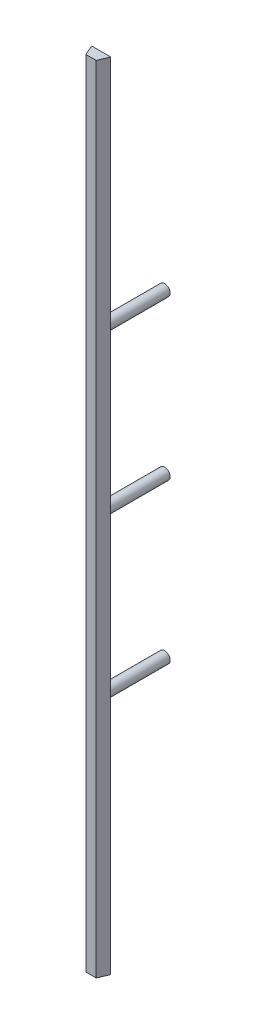
ISO-10303-21;
HEADER;
FILE_DESCRIPTION(('STEP AP214'),'2;1');
FILE_NAME('part.step','',(''),(''),'','','');
FILE_SCHEMA(('AUTOMOTIVE_DESIGN { 1 0 10303 214 1 1 1 1 }'));
ENDSEC;
DATA;
#1=APPLICATION_CONTEXT('core data for automotive mechanical design processes');
#2=APPLICATION_PROTOCOL_DEFINITION('international standard','automotive_design',2000,#1);
#3=PRODUCT_CONTEXT('',#1,'mechanical');
#4=PRODUCT('Part','Part','',(#3));
#5=PRODUCT_RELATED_PRODUCT_CATEGORY('part','',(#4));
#6=PRODUCT_DEFINITION_FORMATION('','',#4);
#7=PRODUCT_DEFINITION_CONTEXT('part definition',#1,'design');
#8=PRODUCT_DEFINITION('design','',#6,#7);
#9=PRODUCT_DEFINITION_SHAPE('','',#8);
#10=(LENGTH_UNIT() NAMED_UNIT(*) SI_UNIT(.MILLI.,.METRE.));
#11=(NAMED_UNIT(*) PLANE_ANGLE_UNIT() SI_UNIT($,.RADIAN.));
#12=(NAMED_UNIT(*) SI_UNIT($,.STERADIAN.) SOLID_ANGLE_UNIT());
#13=UNCERTAINTY_MEASURE_WITH_UNIT(LENGTH_MEASURE(1.E-05),#10,'distance_accuracy_value','');
#14=(GEOMETRIC_REPRESENTATION_CONTEXT(3) GLOBAL_UNCERTAINTY_ASSIGNED_CONTEXT((#13)) GLOBAL_UNIT_ASSIGNED_CONTEXT((#10,
#11,#12)) REPRESENTATION_CONTEXT('',''));
#15=CARTESIAN_POINT('',(0.,0.,0.));
#16=DIRECTION('',(0.,0.,1.));
#17=DIRECTION('',(1.,0.,0.));
#18=AXIS2_PLACEMENT_3D('',#15,#16,#17);
#19=CARTESIAN_POINT('',(-58.9525763948796,5000.,-64.3719659479187));
#20=DIRECTION('',(0.919599513541695,0.,-0.392857142857143));
#21=DIRECTION('',(-0.392857142857143,0.,-0.919599513541695));
#22=AXIS2_PLACEMENT_3D('',#19,#20,#21);
#23=PLANE('',#22);
#24=DIRECTION('',(0.392857142857143,0.,0.919599513541695));
#25=VECTOR('',#24,1.);
#26=CARTESIAN_POINT('',(-58.9525763948796,0.,-64.3719659479187));
#27=LINE('',#26,#25);
#28=CARTESIAN_POINT('',(-58.9525763948796,0.,-64.3719659479187));
#29=VERTEX_POINT('',#28);
#30=CARTESIAN_POINT('',(-31.4525763948796,0.,0.));
#31=VERTEX_POINT('',#30);
#32=EDGE_CURVE('E102',#29,#31,#27,.T.);
#33=ORIENTED_EDGE('',*,*,#32,.T.);
#34=DIRECTION('',(0.,-1.,0.));
#35=VECTOR('',#34,1.);
#36=CARTESIAN_POINT('',(-31.4525763948796,5000.,0.));
#37=LINE('',#36,#35);
#38=CARTESIAN_POINT('',(-31.4525763948796,5000.,0.));
#39=VERTEX_POINT('',#38);
#40=EDGE_CURVE('E93',#39,#31,#37,.T.);
#41=ORIENTED_EDGE('',*,*,#40,.F.);
#42=DIRECTION('',(0.392857142857143,0.,0.919599513541695));
#43=VECTOR('',#42,1.);
#44=CARTESIAN_POINT('',(-58.9525763948796,5000.,-64.3719659479187));
#45=LINE('',#44,#43);
#46=CARTESIAN_POINT('',(-58.9525763948796,5000.,-64.3719659479187));
#47=VERTEX_POINT('',#46);
#48=EDGE_CURVE('E87',#47,#39,#45,.T.);
#49=ORIENTED_EDGE('',*,*,#48,.F.);
#50=DIRECTION('',(0.,-1.,0.));
#51=VECTOR('',#50,1.);
#52=CARTESIAN_POINT('',(-58.9525763948796,5000.,-64.3719659479187));
#53=LINE('',#52,#51);
#54=EDGE_CURVE('E98',#47,#29,#53,.T.);
#55=ORIENTED_EDGE('',*,*,#54,.T.);
#56=EDGE_LOOP('',(#33,#41,#49,#55));
#57=FACE_BOUND('',#56,.T.);
#58=ADVANCED_FACE('F35',(#57),#23,.F.);
#59=CARTESIAN_POINT('',(-31.4525763948796,5000.,0.));
#60=DIRECTION('',(0.,0.,-1.));
#61=DIRECTION('',(-1.,0.,0.));
#62=AXIS2_PLACEMENT_3D('',#59,#60,#61);
#63=PLANE('',#62);
#64=DIRECTION('',(1.,0.,0.));
#65=VECTOR('',#64,1.);
#66=CARTESIAN_POINT('',(-31.4525763948796,0.,0.));
#67=LINE('',#66,#65);
#68=CARTESIAN_POINT('',(33.5474236051204,0.,0.));
#69=VERTEX_POINT('',#68);
#70=EDGE_CURVE('E92',#31,#69,#67,.T.);
#71=ORIENTED_EDGE('',*,*,#70,.T.);
#72=DIRECTION('',(0.,-1.,0.));
#73=VECTOR('',#72,1.);
#74=CARTESIAN_POINT('',(33.5474236051204,5000.,0.));
#75=LINE('',#74,#73);
#76=CARTESIAN_POINT('',(33.5474236051204,5000.,0.));
#77=VERTEX_POINT('',#76);
#78=EDGE_CURVE('E90',#77,#69,#75,.T.);
#79=ORIENTED_EDGE('',*,*,#78,.F.);
#80=DIRECTION('',(1.,0.,0.));
#81=VECTOR('',#80,1.);
#82=CARTESIAN_POINT('',(-31.4525763948796,5000.,0.));
#83=LINE('',#82,#81);
#84=EDGE_CURVE('E82',#39,#77,#83,.T.);
#85=ORIENTED_EDGE('',*,*,#84,.F.);
#86=ORIENTED_EDGE('',*,*,#40,.T.);
#87=EDGE_LOOP('',(#71,#79,#85,#86));
#88=FACE_BOUND('',#87,.T.);
#89=ADVANCED_FACE('F91',(#88),#63,.F.);
#90=CARTESIAN_POINT('',(33.5474236051204,5000.,0.));
#91=DIRECTION('',(-0.919599513541695,0.,-0.392857142857142));
#92=DIRECTION('',(-0.392857142857142,0.,0.919599513541696));
#93=AXIS2_PLACEMENT_3D('',#90,#91,#92);
#94=PLANE('',#93);
#95=DIRECTION('',(0.392857142857142,0.,-0.919599513541696));
#96=VECTOR('',#95,1.);
#97=CARTESIAN_POINT('',(33.5474236051204,0.,0.));
#98=LINE('',#97,#96);
#99=CARTESIAN_POINT('',(61.0474236051204,0.,-64.3719659479187));
#100=VERTEX_POINT('',#99);
#101=EDGE_CURVE('E68',#69,#100,#98,.T.);
#102=ORIENTED_EDGE('',*,*,#101,.T.);
#103=DIRECTION('',(0.,-1.,0.));
#104=VECTOR('',#103,1.);
#105=CARTESIAN_POINT('',(61.0474236051204,5000.,-64.3719659479187));
#106=LINE('',#105,#104);
#107=CARTESIAN_POINT('',(61.0474236051204,5000.,-64.3719659479187));
#108=VERTEX_POINT('',#107);
#109=EDGE_CURVE('E94',#108,#100,#106,.T.);
#110=ORIENTED_EDGE('',*,*,#109,.F.);
#111=DIRECTION('',(0.392857142857142,0.,-0.919599513541696));
#112=VECTOR('',#111,1.);
#113=CARTESIAN_POINT('',(33.5474236051204,5000.,0.));
#114=LINE('',#113,#112);
#115=EDGE_CURVE('E85',#77,#108,#114,.T.);
#116=ORIENTED_EDGE('',*,*,#115,.F.);
#117=ORIENTED_EDGE('',*,*,#78,.T.);
#118=EDGE_LOOP('',(#102,#110,#116,#117));
#119=FACE_BOUND('',#118,.T.);
#120=ADVANCED_FACE('F96',(#119),#94,.F.);
#121=CARTESIAN_POINT('',(61.0474236051204,5000.,-64.3719659479187));
#122=DIRECTION('',(0.,0.,1.));
#123=DIRECTION('',(1.,0.,0.));
#124=AXIS2_PLACEMENT_3D('',#121,#122,#123);
#125=PLANE('',#124);
#126=CARTESIAN_POINT('',(0.,3500.,-64.3719659479187));
#127=DIRECTION('',(0.,0.,1.));
#128=DIRECTION('',(1.,0.,0.));
#129=AXIS2_PLACEMENT_3D('',#126,#127,#128);
#130=CIRCLE('',#129,35.);
#131=CARTESIAN_POINT('',(35.,3500.,-64.3719659479187));
#132=VERTEX_POINT('',#131);
#133=EDGE_CURVE('E11',#132,#132,#130,.F.);
#134=ORIENTED_EDGE('',*,*,#133,.F.);
#135=EDGE_LOOP('',(#134));
#136=FACE_BOUND('',#135,.T.);
#137=CARTESIAN_POINT('',(0.,2500.,-64.3719659479187));
#138=DIRECTION('',(0.,0.,1.));
#139=DIRECTION('',(1.,0.,0.));
#140=AXIS2_PLACEMENT_3D('',#137,#138,#139);
#141=CIRCLE('',#140,35.);
#142=CARTESIAN_POINT('',(35.,2500.,-64.3719659479187));
#143=VERTEX_POINT('',#142);
#144=EDGE_CURVE('E43',#143,#143,#141,.F.);
#145=ORIENTED_EDGE('',*,*,#144,.F.);
#146=EDGE_LOOP('',(#145));
#147=FACE_BOUND('',#146,.T.);
#148=CARTESIAN_POINT('',(0.,1500.,-64.3719659479187));
#149=DIRECTION('',(0.,0.,1.));
#150=DIRECTION('',(1.,0.,0.));
#151=AXIS2_PLACEMENT_3D('',#148,#149,#150);
#152=CIRCLE('',#151,35.);
#153=CARTESIAN_POINT('',(35.,1500.,-64.3719659479187));
#154=VERTEX_POINT('',#153);
#155=EDGE_CURVE('E112',#154,#154,#152,.F.);
#156=ORIENTED_EDGE('',*,*,#155,.F.);
#157=EDGE_LOOP('',(#156));
#158=FACE_BOUND('',#157,.T.);
#159=DIRECTION('',(-1.,0.,0.));
#160=VECTOR('',#159,1.);
#161=CARTESIAN_POINT('',(61.0474236051204,0.,-64.3719659479187));
#162=LINE('',#161,#160);
#163=EDGE_CURVE('E74',#100,#29,#162,.T.);
#164=ORIENTED_EDGE('',*,*,#163,.T.);
#165=ORIENTED_EDGE('',*,*,#54,.F.);
#166=DIRECTION('',(-1.,0.,0.));
#167=VECTOR('',#166,1.);
#168=CARTESIAN_POINT('',(61.0474236051204,5000.,-64.3719659479187));
#169=LINE('',#168,#167);
#170=EDGE_CURVE('E51',#108,#47,#169,.T.);
#171=ORIENTED_EDGE('',*,*,#170,.F.);
#172=ORIENTED_EDGE('',*,*,#109,.T.);
#173=EDGE_LOOP('',(#164,#165,#171,#172));
#174=FACE_BOUND('',#173,.T.);
#175=ADVANCED_FACE('F119',(#136,#147,#158,#174),#125,.F.);
#176=CARTESIAN_POINT('',(0.,5000.,0.));
#177=DIRECTION('',(0.,1.,0.));
#178=DIRECTION('',(0.,0.,1.));
#179=AXIS2_PLACEMENT_3D('',#176,#177,#178);
#180=PLANE('',#179);
#181=ORIENTED_EDGE('',*,*,#48,.T.);
#182=ORIENTED_EDGE('',*,*,#84,.T.);
#183=ORIENTED_EDGE('',*,*,#115,.T.);
#184=ORIENTED_EDGE('',*,*,#170,.T.);
#185=EDGE_LOOP('',(#181,#182,#183,#184));
#186=FACE_BOUND('',#185,.T.);
#187=ADVANCED_FACE('F83',(#186),#180,.T.);
#188=CARTESIAN_POINT('',(0.,0.,0.));
#189=DIRECTION('',(0.,1.,0.));
#190=DIRECTION('',(0.,0.,1.));
#191=AXIS2_PLACEMENT_3D('',#188,#189,#190);
#192=PLANE('',#191);
#193=ORIENTED_EDGE('',*,*,#32,.F.);
#194=ORIENTED_EDGE('',*,*,#163,.F.);
#195=ORIENTED_EDGE('',*,*,#101,.F.);
#196=ORIENTED_EDGE('',*,*,#70,.F.);
#197=EDGE_LOOP('',(#193,#194,#195,#196));
#198=FACE_BOUND('',#197,.T.);
#199=ADVANCED_FACE('F129',(#198),#192,.F.);
#200=CARTESIAN_POINT('',(0.,1500.,-464.371965947919));
#201=DIRECTION('',(0.,0.,1.));
#202=DIRECTION('',(1.,0.,0.));
#203=AXIS2_PLACEMENT_3D('',#200,#201,#202);
#204=CYLINDRICAL_SURFACE('',#203,35.);
#205=CARTESIAN_POINT('',(0.,1500.,-464.371965947919));
#206=DIRECTION('',(0.,0.,-1.));
#207=DIRECTION('',(-1.,0.,0.));
#208=AXIS2_PLACEMENT_3D('',#205,#206,#207);
#209=CIRCLE('',#208,35.);
#210=CARTESIAN_POINT('',(-35.0000000000001,1500.,-464.371965947919));
#211=VERTEX_POINT('',#210);
#212=EDGE_CURVE('E105',#211,#211,#209,.T.);
#213=ORIENTED_EDGE('',*,*,#212,.F.);
#214=EDGE_LOOP('',(#213));
#215=FACE_BOUND('',#214,.T.);
#216=ORIENTED_EDGE('',*,*,#155,.T.);
#217=EDGE_LOOP('',(#216));
#218=FACE_BOUND('',#217,.T.);
#219=ADVANCED_FACE('F126',(#215,#218),#204,.T.);
#220=CARTESIAN_POINT('',(0.,1500.,-464.371965947919));
#221=DIRECTION('',(0.,0.,-1.));
#222=DIRECTION('',(-1.,0.,0.));
#223=AXIS2_PLACEMENT_3D('',#220,#221,#222);
#224=PLANE('',#223);
#225=ORIENTED_EDGE('',*,*,#212,.T.);
#226=EDGE_LOOP('',(#225));
#227=FACE_BOUND('',#226,.T.);
#228=ADVANCED_FACE('F128',(#227),#224,.T.);
#229=CARTESIAN_POINT('',(0.,2500.,-464.371965947919));
#230=DIRECTION('',(0.,0.,1.));
#231=DIRECTION('',(1.,0.,0.));
#232=AXIS2_PLACEMENT_3D('',#229,#230,#231);
#233=CYLINDRICAL_SURFACE('',#232,35.);
#234=CARTESIAN_POINT('',(0.,2500.,-464.371965947919));
#235=DIRECTION('',(0.,0.,-1.));
#236=DIRECTION('',(-1.,0.,0.));
#237=AXIS2_PLACEMENT_3D('',#234,#235,#236);
#238=CIRCLE('',#237,35.);
#239=CARTESIAN_POINT('',(-35.0000000000001,2500.,-464.371965947919));
#240=VERTEX_POINT('',#239);
#241=EDGE_CURVE('E151',#240,#240,#238,.T.);
#242=ORIENTED_EDGE('',*,*,#241,.F.);
#243=EDGE_LOOP('',(#242));
#244=FACE_BOUND('',#243,.T.);
#245=ORIENTED_EDGE('',*,*,#144,.T.);
#246=EDGE_LOOP('',(#245));
#247=FACE_BOUND('',#246,.T.);
#248=ADVANCED_FACE('F117',(#244,#247),#233,.T.);
#249=CARTESIAN_POINT('',(0.,2500.,-464.371965947919));
#250=DIRECTION('',(0.,0.,-1.));
#251=DIRECTION('',(-1.,0.,0.));
#252=AXIS2_PLACEMENT_3D('',#249,#250,#251);
#253=PLANE('',#252);
#254=ORIENTED_EDGE('',*,*,#241,.T.);
#255=EDGE_LOOP('',(#254));
#256=FACE_BOUND('',#255,.T.);
#257=ADVANCED_FACE('F163',(#256),#253,.T.);
#258=CARTESIAN_POINT('',(0.,3500.,-464.371965947919));
#259=DIRECTION('',(0.,0.,1.));
#260=DIRECTION('',(1.,0.,0.));
#261=AXIS2_PLACEMENT_3D('',#258,#259,#260);
#262=CYLINDRICAL_SURFACE('',#261,35.);
#263=CARTESIAN_POINT('',(0.,3500.,-464.371965947919));
#264=DIRECTION('',(0.,0.,-1.));
#265=DIRECTION('',(-1.,0.,0.));
#266=AXIS2_PLACEMENT_3D('',#263,#264,#265);
#267=CIRCLE('',#266,35.);
#268=CARTESIAN_POINT('',(-35.0000000000001,3500.,-464.371965947919));
#269=VERTEX_POINT('',#268);
#270=EDGE_CURVE('E154',#269,#269,#267,.T.);
#271=ORIENTED_EDGE('',*,*,#270,.F.);
#272=EDGE_LOOP('',(#271));
#273=FACE_BOUND('',#272,.T.);
#274=ORIENTED_EDGE('',*,*,#133,.T.);
#275=EDGE_LOOP('',(#274));
#276=FACE_BOUND('',#275,.T.);
#277=ADVANCED_FACE('F160',(#273,#276),#262,.T.);
#278=CARTESIAN_POINT('',(0.,3500.,-464.371965947919));
#279=DIRECTION('',(0.,0.,-1.));
#280=DIRECTION('',(-1.,0.,0.));
#281=AXIS2_PLACEMENT_3D('',#278,#279,#280);
#282=PLANE('',#281);
#283=ORIENTED_EDGE('',*,*,#270,.T.);
#284=EDGE_LOOP('',(#283));
#285=FACE_BOUND('',#284,.T.);
#286=ADVANCED_FACE('F158',(#285),#282,.T.);
#287=CLOSED_SHELL('',(#58,#89,#120,#175,#187,#199,#219,#228,#248,#257,#277,#286));
#288=MANIFOLD_SOLID_BREP('B2',#287);
#289=ADVANCED_BREP_SHAPE_REPRESENTATION('',(#18,#288),#14);
#290=SHAPE_DEFINITION_REPRESENTATION(#9,#289);
ENDSEC;
END-ISO-10303-21;
